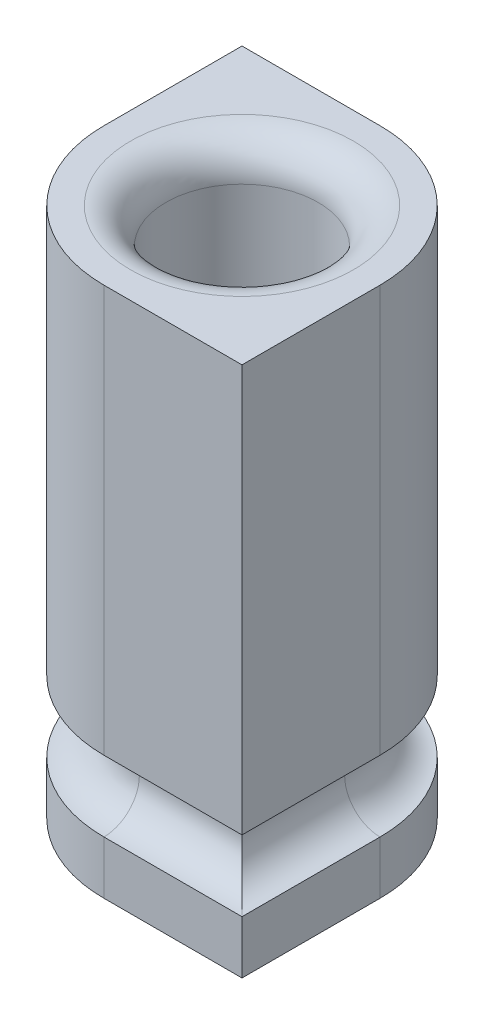
ISO-10303-21;
HEADER;
FILE_DESCRIPTION(('STEP AP214'),'2;1');
FILE_NAME('part.step','',(''),(''),'','','');
FILE_SCHEMA(('AUTOMOTIVE_DESIGN { 1 0 10303 214 1 1 1 1 }'));
ENDSEC;
DATA;
#1=APPLICATION_CONTEXT('core data for automotive mechanical design processes');
#2=APPLICATION_PROTOCOL_DEFINITION('international standard','automotive_design',2000,#1);
#3=PRODUCT_CONTEXT('',#1,'mechanical');
#4=PRODUCT('Part','Part','',(#3));
#5=PRODUCT_RELATED_PRODUCT_CATEGORY('part','',(#4));
#6=PRODUCT_DEFINITION_FORMATION('','',#4);
#7=PRODUCT_DEFINITION_CONTEXT('part definition',#1,'design');
#8=PRODUCT_DEFINITION('design','',#6,#7);
#9=PRODUCT_DEFINITION_SHAPE('','',#8);
#10=(LENGTH_UNIT() NAMED_UNIT(*) SI_UNIT(.MILLI.,.METRE.));
#11=(NAMED_UNIT(*) PLANE_ANGLE_UNIT() SI_UNIT($,.RADIAN.));
#12=(NAMED_UNIT(*) SI_UNIT($,.STERADIAN.) SOLID_ANGLE_UNIT());
#13=UNCERTAINTY_MEASURE_WITH_UNIT(LENGTH_MEASURE(1.E-05),#10,'distance_accuracy_value','');
#14=(GEOMETRIC_REPRESENTATION_CONTEXT(3) GLOBAL_UNCERTAINTY_ASSIGNED_CONTEXT((#13)) GLOBAL_UNIT_ASSIGNED_CONTEXT((#10,
#11,#12)) REPRESENTATION_CONTEXT('',''));
#15=CARTESIAN_POINT('',(0.,0.,0.));
#16=DIRECTION('',(0.,0.,1.));
#17=DIRECTION('',(1.,0.,0.));
#18=AXIS2_PLACEMENT_3D('',#15,#16,#17);
#19=CARTESIAN_POINT('',(3.9,5.,0.));
#20=DIRECTION('',(-1.,0.,0.));
#21=DIRECTION('',(0.,0.,1.));
#22=AXIS2_PLACEMENT_3D('',#19,#20,#21);
#23=PLANE('',#22);
#24=DIRECTION('',(0.,-1.,0.));
#25=VECTOR('',#24,1.);
#26=CARTESIAN_POINT('',(3.9,5.,3.9));
#27=LINE('',#26,#25);
#28=CARTESIAN_POINT('',(3.9,15.,3.9));
#29=VERTEX_POINT('',#28);
#30=CARTESIAN_POINT('',(3.9,3.5,3.9));
#31=VERTEX_POINT('',#30);
#32=EDGE_CURVE('E141',#29,#31,#27,.T.);
#33=ORIENTED_EDGE('',*,*,#32,.T.);
#34=DIRECTION('',(0.,0.,-1.));
#35=VECTOR('',#34,1.);
#36=CARTESIAN_POINT('',(3.9,3.5,0.));
#37=LINE('',#36,#35);
#38=CARTESIAN_POINT('',(3.9,3.5,0.));
#39=VERTEX_POINT('',#38);
#40=EDGE_CURVE('E568',#31,#39,#37,.T.);
#41=ORIENTED_EDGE('',*,*,#40,.T.);
#42=DIRECTION('',(0.,-1.,0.));
#43=VECTOR('',#42,1.);
#44=CARTESIAN_POINT('',(3.9,5.,0.));
#45=LINE('',#44,#43);
#46=CARTESIAN_POINT('',(3.9,15.,0.));
#47=VERTEX_POINT('',#46);
#48=EDGE_CURVE('E188',#47,#39,#45,.T.);
#49=ORIENTED_EDGE('',*,*,#48,.F.);
#50=DIRECTION('',(0.,0.,-1.));
#51=VECTOR('',#50,1.);
#52=CARTESIAN_POINT('',(3.9,15.,0.));
#53=LINE('',#52,#51);
#54=EDGE_CURVE('E195',#29,#47,#53,.T.);
#55=ORIENTED_EDGE('',*,*,#54,.F.);
#56=EDGE_LOOP('',(#33,#41,#49,#55));
#57=FACE_BOUND('',#56,.T.);
#58=ADVANCED_FACE('F33',(#57),#23,.F.);
#59=CARTESIAN_POINT('',(0.,5.,0.));
#60=DIRECTION('',(0.,-1.,0.));
#61=DIRECTION('',(0.,0.,-1.));
#62=AXIS2_PLACEMENT_3D('',#59,#60,#61);
#63=CYLINDRICAL_SURFACE('',#62,3.9);
#64=ORIENTED_EDGE('',*,*,#48,.T.);
#65=CARTESIAN_POINT('',(0.,3.5,0.));
#66=DIRECTION('',(0.,1.,0.));
#67=DIRECTION('',(0.,0.,1.));
#68=AXIS2_PLACEMENT_3D('',#65,#66,#67);
#69=CIRCLE('',#68,3.9);
#70=CARTESIAN_POINT('',(0.,3.5,-3.9));
#71=VERTEX_POINT('',#70);
#72=EDGE_CURVE('E571',#39,#71,#69,.T.);
#73=ORIENTED_EDGE('',*,*,#72,.T.);
#74=DIRECTION('',(0.,-1.,0.));
#75=VECTOR('',#74,1.);
#76=CARTESIAN_POINT('',(0.,5.,-3.9));
#77=LINE('',#76,#75);
#78=CARTESIAN_POINT('',(0.,15.,-3.9));
#79=VERTEX_POINT('',#78);
#80=EDGE_CURVE('E184',#79,#71,#77,.T.);
#81=ORIENTED_EDGE('',*,*,#80,.F.);
#82=CARTESIAN_POINT('',(0.,15.,0.));
#83=DIRECTION('',(0.,1.,0.));
#84=DIRECTION('',(0.,0.,1.));
#85=AXIS2_PLACEMENT_3D('',#82,#83,#84);
#86=CIRCLE('',#85,3.9);
#87=EDGE_CURVE('E592',#47,#79,#86,.T.);
#88=ORIENTED_EDGE('',*,*,#87,.F.);
#89=EDGE_LOOP('',(#64,#73,#81,#88));
#90=FACE_BOUND('',#89,.T.);
#91=ADVANCED_FACE('F256',(#90),#63,.T.);
#92=CARTESIAN_POINT('',(-3.9,5.,-3.9));
#93=DIRECTION('',(0.,0.,1.));
#94=DIRECTION('',(1.,0.,0.));
#95=AXIS2_PLACEMENT_3D('',#92,#93,#94);
#96=PLANE('',#95);
#97=ORIENTED_EDGE('',*,*,#80,.T.);
#98=DIRECTION('',(-1.,0.,0.));
#99=VECTOR('',#98,1.);
#100=CARTESIAN_POINT('',(-3.9,3.5,-3.9));
#101=LINE('',#100,#99);
#102=CARTESIAN_POINT('',(-3.9,3.5,-3.9));
#103=VERTEX_POINT('',#102);
#104=EDGE_CURVE('E161',#71,#103,#101,.T.);
#105=ORIENTED_EDGE('',*,*,#104,.T.);
#106=DIRECTION('',(0.,-1.,0.));
#107=VECTOR('',#106,1.);
#108=CARTESIAN_POINT('',(-3.9,5.,-3.9));
#109=LINE('',#108,#107);
#110=CARTESIAN_POINT('',(-3.9,15.,-3.9));
#111=VERTEX_POINT('',#110);
#112=EDGE_CURVE('E180',#111,#103,#109,.T.);
#113=ORIENTED_EDGE('',*,*,#112,.F.);
#114=DIRECTION('',(-1.,0.,0.));
#115=VECTOR('',#114,1.);
#116=CARTESIAN_POINT('',(0.,15.,-3.9));
#117=LINE('',#116,#115);
#118=EDGE_CURVE('E588',#79,#111,#117,.T.);
#119=ORIENTED_EDGE('',*,*,#118,.F.);
#120=EDGE_LOOP('',(#97,#105,#113,#119));
#121=FACE_BOUND('',#120,.T.);
#122=ADVANCED_FACE('F262',(#121),#96,.F.);
#123=CARTESIAN_POINT('',(-3.9,5.,-3.9));
#124=DIRECTION('',(1.,0.,0.));
#125=DIRECTION('',(0.,0.,-1.));
#126=AXIS2_PLACEMENT_3D('',#123,#124,#125);
#127=PLANE('',#126);
#128=ORIENTED_EDGE('',*,*,#112,.T.);
#129=DIRECTION('',(0.,0.,1.));
#130=VECTOR('',#129,1.);
#131=CARTESIAN_POINT('',(-3.9,3.5,0.));
#132=LINE('',#131,#130);
#133=CARTESIAN_POINT('',(-3.9,3.5,0.));
#134=VERTEX_POINT('',#133);
#135=EDGE_CURVE('E157',#103,#134,#132,.T.);
#136=ORIENTED_EDGE('',*,*,#135,.T.);
#137=DIRECTION('',(0.,-1.,0.));
#138=VECTOR('',#137,1.);
#139=CARTESIAN_POINT('',(-3.9,5.,0.));
#140=LINE('',#139,#138);
#141=CARTESIAN_POINT('',(-3.9,15.,0.));
#142=VERTEX_POINT('',#141);
#143=EDGE_CURVE('E176',#142,#134,#140,.T.);
#144=ORIENTED_EDGE('',*,*,#143,.F.);
#145=DIRECTION('',(0.,0.,1.));
#146=VECTOR('',#145,1.);
#147=CARTESIAN_POINT('',(-3.9,15.,-3.9));
#148=LINE('',#147,#146);
#149=EDGE_CURVE('E580',#111,#142,#148,.T.);
#150=ORIENTED_EDGE('',*,*,#149,.F.);
#151=EDGE_LOOP('',(#128,#136,#144,#150));
#152=FACE_BOUND('',#151,.T.);
#153=ADVANCED_FACE('F284',(#152),#127,.F.);
#154=CARTESIAN_POINT('',(0.,5.,0.));
#155=DIRECTION('',(0.,-1.,0.));
#156=DIRECTION('',(0.,0.,-1.));
#157=AXIS2_PLACEMENT_3D('',#154,#155,#156);
#158=CYLINDRICAL_SURFACE('',#157,3.9);
#159=ORIENTED_EDGE('',*,*,#143,.T.);
#160=CARTESIAN_POINT('',(0.,3.5,0.));
#161=DIRECTION('',(0.,1.,0.));
#162=DIRECTION('',(0.,0.,1.));
#163=AXIS2_PLACEMENT_3D('',#160,#161,#162);
#164=CIRCLE('',#163,3.9);
#165=CARTESIAN_POINT('',(0.,3.5,3.9));
#166=VERTEX_POINT('',#165);
#167=EDGE_CURVE('E542',#134,#166,#164,.T.);
#168=ORIENTED_EDGE('',*,*,#167,.T.);
#169=DIRECTION('',(0.,-1.,0.));
#170=VECTOR('',#169,1.);
#171=CARTESIAN_POINT('',(0.,5.,3.9));
#172=LINE('',#171,#170);
#173=CARTESIAN_POINT('',(0.,15.,3.9));
#174=VERTEX_POINT('',#173);
#175=EDGE_CURVE('E172',#174,#166,#172,.T.);
#176=ORIENTED_EDGE('',*,*,#175,.F.);
#177=CARTESIAN_POINT('',(0.,15.,0.));
#178=DIRECTION('',(0.,1.,0.));
#179=DIRECTION('',(0.,0.,1.));
#180=AXIS2_PLACEMENT_3D('',#177,#178,#179);
#181=CIRCLE('',#180,3.9);
#182=EDGE_CURVE('E587',#142,#174,#181,.T.);
#183=ORIENTED_EDGE('',*,*,#182,.F.);
#184=EDGE_LOOP('',(#159,#168,#176,#183));
#185=FACE_BOUND('',#184,.T.);
#186=ADVANCED_FACE('F288',(#185),#158,.T.);
#187=CARTESIAN_POINT('',(0.,5.,3.9));
#188=DIRECTION('',(0.,0.,-1.));
#189=DIRECTION('',(-1.,0.,0.));
#190=AXIS2_PLACEMENT_3D('',#187,#188,#189);
#191=PLANE('',#190);
#192=ORIENTED_EDGE('',*,*,#175,.T.);
#193=DIRECTION('',(1.,0.,0.));
#194=VECTOR('',#193,1.);
#195=CARTESIAN_POINT('',(3.9,3.5,3.9));
#196=LINE('',#195,#194);
#197=EDGE_CURVE('E566',#166,#31,#196,.T.);
#198=ORIENTED_EDGE('',*,*,#197,.T.);
#199=ORIENTED_EDGE('',*,*,#32,.F.);
#200=DIRECTION('',(1.,0.,0.));
#201=VECTOR('',#200,1.);
#202=CARTESIAN_POINT('',(3.9,15.,3.9));
#203=LINE('',#202,#201);
#204=EDGE_CURVE('E590',#174,#29,#203,.T.);
#205=ORIENTED_EDGE('',*,*,#204,.F.);
#206=EDGE_LOOP('',(#192,#198,#199,#205));
#207=FACE_BOUND('',#206,.T.);
#208=ADVANCED_FACE('F292',(#207),#191,.F.);
#209=CARTESIAN_POINT('',(0.,0.,0.));
#210=DIRECTION('',(0.,1.,0.));
#211=DIRECTION('',(0.,0.,1.));
#212=AXIS2_PLACEMENT_3D('',#209,#210,#211);
#213=PLANE('',#212);
#214=DIRECTION('',(0.,0.,-1.));
#215=VECTOR('',#214,1.);
#216=CARTESIAN_POINT('',(3.9,0.,0.));
#217=LINE('',#216,#215);
#218=CARTESIAN_POINT('',(3.9,0.,3.9));
#219=VERTEX_POINT('',#218);
#220=CARTESIAN_POINT('',(3.9,0.,0.));
#221=VERTEX_POINT('',#220);
#222=EDGE_CURVE('E139',#219,#221,#217,.T.);
#223=ORIENTED_EDGE('',*,*,#222,.F.);
#224=DIRECTION('',(1.,0.,0.));
#225=VECTOR('',#224,1.);
#226=CARTESIAN_POINT('',(0.,0.,3.9));
#227=LINE('',#226,#225);
#228=CARTESIAN_POINT('',(0.,0.,3.9));
#229=VERTEX_POINT('',#228);
#230=EDGE_CURVE('E142',#229,#219,#227,.T.);
#231=ORIENTED_EDGE('',*,*,#230,.F.);
#232=CARTESIAN_POINT('',(0.,0.,0.));
#233=DIRECTION('',(0.,1.,0.));
#234=DIRECTION('',(0.,0.,1.));
#235=AXIS2_PLACEMENT_3D('',#232,#233,#234);
#236=CIRCLE('',#235,3.9);
#237=CARTESIAN_POINT('',(-3.9,0.,0.));
#238=VERTEX_POINT('',#237);
#239=EDGE_CURVE('E150',#238,#229,#236,.T.);
#240=ORIENTED_EDGE('',*,*,#239,.F.);
#241=DIRECTION('',(0.,0.,1.));
#242=VECTOR('',#241,1.);
#243=CARTESIAN_POINT('',(-3.9,0.,-3.9));
#244=LINE('',#243,#242);
#245=CARTESIAN_POINT('',(-3.9,0.,-3.9));
#246=VERTEX_POINT('',#245);
#247=EDGE_CURVE('E167',#246,#238,#244,.T.);
#248=ORIENTED_EDGE('',*,*,#247,.F.);
#249=DIRECTION('',(-1.,0.,0.));
#250=VECTOR('',#249,1.);
#251=CARTESIAN_POINT('',(-3.9,0.,-3.9));
#252=LINE('',#251,#250);
#253=CARTESIAN_POINT('',(0.,0.,-3.9));
#254=VERTEX_POINT('',#253);
#255=EDGE_CURVE('E159',#254,#246,#252,.T.);
#256=ORIENTED_EDGE('',*,*,#255,.F.);
#257=CARTESIAN_POINT('',(0.,0.,0.));
#258=DIRECTION('',(0.,1.,0.));
#259=DIRECTION('',(0.,0.,1.));
#260=AXIS2_PLACEMENT_3D('',#257,#258,#259);
#261=CIRCLE('',#260,3.9);
#262=EDGE_CURVE('E156',#221,#254,#261,.T.);
#263=ORIENTED_EDGE('',*,*,#262,.F.);
#264=EDGE_LOOP('',(#223,#231,#240,#248,#256,#263));
#265=FACE_BOUND('',#264,.T.);
#266=ADVANCED_FACE('F153',(#265),#213,.F.);
#267=DIRECTION('',(1.,0.,0.));
#268=VECTOR('',#267,1.);
#269=CARTESIAN_POINT('',(3.9,1.5,3.9));
#270=LINE('',#269,#268);
#271=CARTESIAN_POINT('',(0.,1.5,3.9));
#272=VERTEX_POINT('',#271);
#273=CARTESIAN_POINT('',(3.9,1.5,3.9));
#274=VERTEX_POINT('',#273);
#275=EDGE_CURVE('E50',#272,#274,#270,.T.);
#276=ORIENTED_EDGE('',*,*,#275,.F.);
#277=EDGE_CURVE('E146',#272,#229,#172,.T.);
#278=ORIENTED_EDGE('',*,*,#277,.T.);
#279=ORIENTED_EDGE('',*,*,#230,.T.);
#280=EDGE_CURVE('E134',#274,#219,#27,.T.);
#281=ORIENTED_EDGE('',*,*,#280,.F.);
#282=EDGE_LOOP('',(#276,#278,#279,#281));
#283=FACE_BOUND('',#282,.T.);
#284=ADVANCED_FACE('F145',(#283),#191,.F.);
#285=CARTESIAN_POINT('',(0.,1.5,0.));
#286=DIRECTION('',(0.,1.,0.));
#287=DIRECTION('',(0.,0.,1.));
#288=AXIS2_PLACEMENT_3D('',#285,#286,#287);
#289=CIRCLE('',#288,3.9);
#290=CARTESIAN_POINT('',(-3.9,1.5,0.));
#291=VERTEX_POINT('',#290);
#292=EDGE_CURVE('E238',#291,#272,#289,.T.);
#293=ORIENTED_EDGE('',*,*,#292,.F.);
#294=EDGE_CURVE('E175',#291,#238,#140,.T.);
#295=ORIENTED_EDGE('',*,*,#294,.T.);
#296=ORIENTED_EDGE('',*,*,#239,.T.);
#297=ORIENTED_EDGE('',*,*,#277,.F.);
#298=EDGE_LOOP('',(#293,#295,#296,#297));
#299=FACE_BOUND('',#298,.T.);
#300=ADVANCED_FACE('F294',(#299),#158,.T.);
#301=DIRECTION('',(0.,0.,1.));
#302=VECTOR('',#301,1.);
#303=CARTESIAN_POINT('',(-3.9,1.5,0.));
#304=LINE('',#303,#302);
#305=CARTESIAN_POINT('',(-3.9,1.5,-3.9));
#306=VERTEX_POINT('',#305);
#307=EDGE_CURVE('E538',#306,#291,#304,.T.);
#308=ORIENTED_EDGE('',*,*,#307,.F.);
#309=EDGE_CURVE('E179',#306,#246,#109,.T.);
#310=ORIENTED_EDGE('',*,*,#309,.T.);
#311=ORIENTED_EDGE('',*,*,#247,.T.);
#312=ORIENTED_EDGE('',*,*,#294,.F.);
#313=EDGE_LOOP('',(#308,#310,#311,#312));
#314=FACE_BOUND('',#313,.T.);
#315=ADVANCED_FACE('F279',(#314),#127,.F.);
#316=DIRECTION('',(-1.,0.,0.));
#317=VECTOR('',#316,1.);
#318=CARTESIAN_POINT('',(-3.9,1.5,-3.9));
#319=LINE('',#318,#317);
#320=CARTESIAN_POINT('',(0.,1.5,-3.9));
#321=VERTEX_POINT('',#320);
#322=EDGE_CURVE('E543',#321,#306,#319,.T.);
#323=ORIENTED_EDGE('',*,*,#322,.F.);
#324=EDGE_CURVE('E183',#321,#254,#77,.T.);
#325=ORIENTED_EDGE('',*,*,#324,.T.);
#326=ORIENTED_EDGE('',*,*,#255,.T.);
#327=ORIENTED_EDGE('',*,*,#309,.F.);
#328=EDGE_LOOP('',(#323,#325,#326,#327));
#329=FACE_BOUND('',#328,.T.);
#330=ADVANCED_FACE('F274',(#329),#96,.F.);
#331=CARTESIAN_POINT('',(0.,1.5,0.));
#332=DIRECTION('',(0.,1.,0.));
#333=DIRECTION('',(0.,0.,1.));
#334=AXIS2_PLACEMENT_3D('',#331,#332,#333);
#335=CIRCLE('',#334,3.9);
#336=CARTESIAN_POINT('',(3.9,1.5,0.));
#337=VERTEX_POINT('',#336);
#338=EDGE_CURVE('E558',#337,#321,#335,.T.);
#339=ORIENTED_EDGE('',*,*,#338,.F.);
#340=EDGE_CURVE('E187',#337,#221,#45,.T.);
#341=ORIENTED_EDGE('',*,*,#340,.T.);
#342=ORIENTED_EDGE('',*,*,#262,.T.);
#343=ORIENTED_EDGE('',*,*,#324,.F.);
#344=EDGE_LOOP('',(#339,#341,#342,#343));
#345=FACE_BOUND('',#344,.T.);
#346=ADVANCED_FACE('F265',(#345),#63,.T.);
#347=DIRECTION('',(0.,0.,-1.));
#348=VECTOR('',#347,1.);
#349=CARTESIAN_POINT('',(3.9,1.5,0.));
#350=LINE('',#349,#348);
#351=EDGE_CURVE('E140',#274,#337,#350,.T.);
#352=ORIENTED_EDGE('',*,*,#351,.F.);
#353=ORIENTED_EDGE('',*,*,#280,.T.);
#354=ORIENTED_EDGE('',*,*,#222,.T.);
#355=ORIENTED_EDGE('',*,*,#340,.F.);
#356=EDGE_LOOP('',(#352,#353,#354,#355));
#357=FACE_BOUND('',#356,.T.);
#358=ADVANCED_FACE('F136',(#357),#23,.F.);
#359=CARTESIAN_POINT('',(-3.9,2.5,0.));
#360=DIRECTION('',(0.,0.,1.));
#361=DIRECTION('',(1.,0.,0.));
#362=AXIS2_PLACEMENT_3D('',#359,#360,#361);
#363=CYLINDRICAL_SURFACE('',#362,1.);
#364=CARTESIAN_POINT('',(-3.9,2.5,-3.9));
#365=DIRECTION('',(-0.707106781186547,0.,0.707106781186547));
#366=DIRECTION('',(-0.707106781186547,0.,-0.707106781186547));
#367=AXIS2_PLACEMENT_3D('',#364,#365,#366);
#368=ELLIPSE('',#367,1.41421356237309,1.);
#369=CARTESIAN_POINT('',(-2.9,2.5,-2.9));
#370=VERTEX_POINT('',#369);
#371=EDGE_CURVE('E234',#306,#370,#368,.T.);
#372=ORIENTED_EDGE('',*,*,#371,.F.);
#373=ORIENTED_EDGE('',*,*,#307,.T.);
#374=CARTESIAN_POINT('',(-3.9,2.5,0.));
#375=DIRECTION('',(0.,0.,-1.));
#376=DIRECTION('',(-1.,0.,0.));
#377=AXIS2_PLACEMENT_3D('',#374,#375,#376);
#378=CIRCLE('',#377,1.);
#379=CARTESIAN_POINT('',(-2.9,2.5,0.));
#380=VERTEX_POINT('',#379);
#381=EDGE_CURVE('E80',#380,#291,#378,.T.);
#382=ORIENTED_EDGE('',*,*,#381,.F.);
#383=DIRECTION('',(0.,0.,1.));
#384=VECTOR('',#383,1.);
#385=CARTESIAN_POINT('',(-2.9,2.5,0.));
#386=LINE('',#385,#384);
#387=EDGE_CURVE('E75',#370,#380,#386,.T.);
#388=ORIENTED_EDGE('',*,*,#387,.F.);
#389=EDGE_LOOP('',(#372,#373,#382,#388));
#390=FACE_BOUND('',#389,.T.);
#391=ADVANCED_FACE('F268',(#390),#363,.F.);
#392=CARTESIAN_POINT('',(0.,2.5,0.));
#393=DIRECTION('',(0.,1.,0.));
#394=DIRECTION('',(0.,0.,1.));
#395=AXIS2_PLACEMENT_3D('',#392,#393,#394);
#396=TOROIDAL_SURFACE('',#395,3.9,1.);
#397=ORIENTED_EDGE('',*,*,#381,.T.);
#398=ORIENTED_EDGE('',*,*,#292,.T.);
#399=CARTESIAN_POINT('',(0.,2.5,3.9));
#400=DIRECTION('',(-1.,0.,0.));
#401=DIRECTION('',(0.,0.,1.));
#402=AXIS2_PLACEMENT_3D('',#399,#400,#401);
#403=CIRCLE('',#402,1.);
#404=CARTESIAN_POINT('',(0.,2.5,2.9));
#405=VERTEX_POINT('',#404);
#406=EDGE_CURVE('E231',#405,#272,#403,.T.);
#407=ORIENTED_EDGE('',*,*,#406,.F.);
#408=CARTESIAN_POINT('',(0.,2.5,0.));
#409=DIRECTION('',(0.,1.,0.));
#410=DIRECTION('',(0.,0.,1.));
#411=AXIS2_PLACEMENT_3D('',#408,#409,#410);
#412=CIRCLE('',#411,2.9);
#413=EDGE_CURVE('E228',#380,#405,#412,.T.);
#414=ORIENTED_EDGE('',*,*,#413,.F.);
#415=EDGE_LOOP('',(#397,#398,#407,#414));
#416=FACE_BOUND('',#415,.T.);
#417=ADVANCED_FACE('F273',(#416),#396,.F.);
#418=CARTESIAN_POINT('',(-3.9,2.5,0.));
#419=DIRECTION('',(0.,0.,-1.));
#420=DIRECTION('',(-1.,0.,0.));
#421=AXIS2_PLACEMENT_3D('',#418,#419,#420);
#422=CYLINDRICAL_SURFACE('',#421,1.);
#423=CARTESIAN_POINT('',(-3.9,2.5,-3.9));
#424=DIRECTION('',(0.707106781186547,0.,-0.707106781186547));
#425=DIRECTION('',(-0.707106781186547,0.,-0.707106781186547));
#426=AXIS2_PLACEMENT_3D('',#423,#424,#425);
#427=ELLIPSE('',#426,1.41421356237309,1.);
#428=EDGE_CURVE('E222',#370,#103,#427,.F.);
#429=ORIENTED_EDGE('',*,*,#428,.F.);
#430=ORIENTED_EDGE('',*,*,#387,.T.);
#431=CARTESIAN_POINT('',(-3.9,2.5,0.));
#432=DIRECTION('',(0.,0.,-1.));
#433=DIRECTION('',(-1.,0.,0.));
#434=AXIS2_PLACEMENT_3D('',#431,#432,#433);
#435=CIRCLE('',#434,1.);
#436=EDGE_CURVE('E225',#134,#380,#435,.T.);
#437=ORIENTED_EDGE('',*,*,#436,.F.);
#438=ORIENTED_EDGE('',*,*,#135,.F.);
#439=EDGE_LOOP('',(#429,#430,#437,#438));
#440=FACE_BOUND('',#439,.T.);
#441=ADVANCED_FACE('F459',(#440),#422,.F.);
#442=CARTESIAN_POINT('',(-2.9,2.5,-3.9));
#443=DIRECTION('',(-1.,0.,0.));
#444=DIRECTION('',(0.,0.,1.));
#445=AXIS2_PLACEMENT_3D('',#442,#443,#444);
#446=CYLINDRICAL_SURFACE('',#445,1.);
#447=ORIENTED_EDGE('',*,*,#322,.T.);
#448=ORIENTED_EDGE('',*,*,#371,.T.);
#449=DIRECTION('',(-1.,0.,0.));
#450=VECTOR('',#449,1.);
#451=CARTESIAN_POINT('',(-2.9,2.5,-2.9));
#452=LINE('',#451,#450);
#453=CARTESIAN_POINT('',(0.,2.5,-2.9));
#454=VERTEX_POINT('',#453);
#455=EDGE_CURVE('E219',#454,#370,#452,.T.);
#456=ORIENTED_EDGE('',*,*,#455,.F.);
#457=CARTESIAN_POINT('',(0.,2.5,-3.9));
#458=DIRECTION('',(-1.,0.,0.));
#459=DIRECTION('',(0.,0.,1.));
#460=AXIS2_PLACEMENT_3D('',#457,#458,#459);
#461=CIRCLE('',#460,1.);
#462=EDGE_CURVE('E216',#321,#454,#461,.T.);
#463=ORIENTED_EDGE('',*,*,#462,.F.);
#464=EDGE_LOOP('',(#447,#448,#456,#463));
#465=FACE_BOUND('',#464,.T.);
#466=ADVANCED_FACE('F449',(#465),#446,.F.);
#467=CARTESIAN_POINT('',(2.9,2.5,3.9));
#468=DIRECTION('',(1.,0.,0.));
#469=DIRECTION('',(0.,0.,-1.));
#470=AXIS2_PLACEMENT_3D('',#467,#468,#469);
#471=CYLINDRICAL_SURFACE('',#470,1.);
#472=ORIENTED_EDGE('',*,*,#406,.T.);
#473=ORIENTED_EDGE('',*,*,#275,.T.);
#474=CARTESIAN_POINT('',(3.9,2.5,3.9));
#475=DIRECTION('',(0.707106781186547,0.,-0.707106781186547));
#476=DIRECTION('',(0.707106781186547,0.,0.707106781186547));
#477=AXIS2_PLACEMENT_3D('',#474,#475,#476);
#478=ELLIPSE('',#477,1.41421356237309,1.);
#479=CARTESIAN_POINT('',(2.9,2.5,2.9));
#480=VERTEX_POINT('',#479);
#481=EDGE_CURVE('E87',#480,#274,#478,.F.);
#482=ORIENTED_EDGE('',*,*,#481,.F.);
#483=DIRECTION('',(1.,0.,0.));
#484=VECTOR('',#483,1.);
#485=CARTESIAN_POINT('',(2.9,2.5,2.9));
#486=LINE('',#485,#484);
#487=EDGE_CURVE('E210',#405,#480,#486,.T.);
#488=ORIENTED_EDGE('',*,*,#487,.F.);
#489=EDGE_LOOP('',(#472,#473,#482,#488));
#490=FACE_BOUND('',#489,.T.);
#491=ADVANCED_FACE('F439',(#490),#471,.F.);
#492=CARTESIAN_POINT('',(0.,2.5,0.));
#493=DIRECTION('',(0.,1.,0.));
#494=DIRECTION('',(0.,0.,1.));
#495=AXIS2_PLACEMENT_3D('',#492,#493,#494);
#496=TOROIDAL_SURFACE('',#495,3.9,1.);
#497=ORIENTED_EDGE('',*,*,#436,.T.);
#498=ORIENTED_EDGE('',*,*,#413,.T.);
#499=CARTESIAN_POINT('',(0.,2.5,3.9));
#500=DIRECTION('',(-1.,0.,0.));
#501=DIRECTION('',(0.,0.,1.));
#502=AXIS2_PLACEMENT_3D('',#499,#500,#501);
#503=CIRCLE('',#502,1.);
#504=EDGE_CURVE('E207',#166,#405,#503,.T.);
#505=ORIENTED_EDGE('',*,*,#504,.F.);
#506=ORIENTED_EDGE('',*,*,#167,.F.);
#507=EDGE_LOOP('',(#497,#498,#505,#506));
#508=FACE_BOUND('',#507,.T.);
#509=ADVANCED_FACE('F429',(#508),#496,.F.);
#510=CARTESIAN_POINT('',(0.,2.5,-3.9));
#511=DIRECTION('',(1.,0.,0.));
#512=DIRECTION('',(0.,0.,-1.));
#513=AXIS2_PLACEMENT_3D('',#510,#511,#512);
#514=CYLINDRICAL_SURFACE('',#513,1.);
#515=ORIENTED_EDGE('',*,*,#428,.T.);
#516=ORIENTED_EDGE('',*,*,#104,.F.);
#517=CARTESIAN_POINT('',(0.,2.5,-3.9));
#518=DIRECTION('',(-1.,0.,0.));
#519=DIRECTION('',(0.,0.,1.));
#520=AXIS2_PLACEMENT_3D('',#517,#518,#519);
#521=CIRCLE('',#520,1.);
#522=EDGE_CURVE('E204',#454,#71,#521,.T.);
#523=ORIENTED_EDGE('',*,*,#522,.F.);
#524=ORIENTED_EDGE('',*,*,#455,.T.);
#525=EDGE_LOOP('',(#515,#516,#523,#524));
#526=FACE_BOUND('',#525,.T.);
#527=ADVANCED_FACE('F419',(#526),#514,.F.);
#528=CARTESIAN_POINT('',(0.,2.5,0.));
#529=DIRECTION('',(0.,1.,0.));
#530=DIRECTION('',(0.,0.,1.));
#531=AXIS2_PLACEMENT_3D('',#528,#529,#530);
#532=TOROIDAL_SURFACE('',#531,3.9,1.);
#533=CARTESIAN_POINT('',(3.9,2.5,0.));
#534=DIRECTION('',(0.,0.,-1.));
#535=DIRECTION('',(-1.,0.,0.));
#536=AXIS2_PLACEMENT_3D('',#533,#534,#535);
#537=CIRCLE('',#536,1.);
#538=CARTESIAN_POINT('',(2.9,2.5,0.));
#539=VERTEX_POINT('',#538);
#540=EDGE_CURVE('E214',#337,#539,#537,.T.);
#541=ORIENTED_EDGE('',*,*,#540,.F.);
#542=ORIENTED_EDGE('',*,*,#338,.T.);
#543=ORIENTED_EDGE('',*,*,#462,.T.);
#544=CARTESIAN_POINT('',(0.,2.5,0.));
#545=DIRECTION('',(0.,1.,0.));
#546=DIRECTION('',(0.,0.,1.));
#547=AXIS2_PLACEMENT_3D('',#544,#545,#546);
#548=CIRCLE('',#547,2.9);
#549=EDGE_CURVE('E201',#539,#454,#548,.T.);
#550=ORIENTED_EDGE('',*,*,#549,.F.);
#551=EDGE_LOOP('',(#541,#542,#543,#550));
#552=FACE_BOUND('',#551,.T.);
#553=ADVANCED_FACE('F410',(#552),#532,.F.);
#554=CARTESIAN_POINT('',(3.9,2.5,0.));
#555=DIRECTION('',(0.,0.,-1.));
#556=DIRECTION('',(-1.,0.,0.));
#557=AXIS2_PLACEMENT_3D('',#554,#555,#556);
#558=CYLINDRICAL_SURFACE('',#557,1.);
#559=ORIENTED_EDGE('',*,*,#351,.T.);
#560=ORIENTED_EDGE('',*,*,#540,.T.);
#561=DIRECTION('',(0.,0.,-1.));
#562=VECTOR('',#561,1.);
#563=CARTESIAN_POINT('',(2.9,2.5,0.));
#564=LINE('',#563,#562);
#565=EDGE_CURVE('E198',#480,#539,#564,.T.);
#566=ORIENTED_EDGE('',*,*,#565,.F.);
#567=ORIENTED_EDGE('',*,*,#481,.T.);
#568=EDGE_LOOP('',(#559,#560,#566,#567));
#569=FACE_BOUND('',#568,.T.);
#570=ADVANCED_FACE('F400',(#569),#558,.F.);
#571=CARTESIAN_POINT('',(0.,2.5,3.9));
#572=DIRECTION('',(-1.,0.,0.));
#573=DIRECTION('',(0.,0.,1.));
#574=AXIS2_PLACEMENT_3D('',#571,#572,#573);
#575=CYLINDRICAL_SURFACE('',#574,1.);
#576=ORIENTED_EDGE('',*,*,#504,.T.);
#577=ORIENTED_EDGE('',*,*,#487,.T.);
#578=CARTESIAN_POINT('',(3.9,2.5,3.9));
#579=DIRECTION('',(-0.707106781186547,0.,0.707106781186547));
#580=DIRECTION('',(-0.707106781186547,0.,-0.707106781186547));
#581=AXIS2_PLACEMENT_3D('',#578,#579,#580);
#582=ELLIPSE('',#581,1.41421356237309,1.);
#583=EDGE_CURVE('E194',#31,#480,#582,.T.);
#584=ORIENTED_EDGE('',*,*,#583,.F.);
#585=ORIENTED_EDGE('',*,*,#197,.F.);
#586=EDGE_LOOP('',(#576,#577,#584,#585));
#587=FACE_BOUND('',#586,.T.);
#588=ADVANCED_FACE('F390',(#587),#575,.F.);
#589=CARTESIAN_POINT('',(0.,2.5,0.));
#590=DIRECTION('',(0.,1.,0.));
#591=DIRECTION('',(0.,0.,1.));
#592=AXIS2_PLACEMENT_3D('',#589,#590,#591);
#593=TOROIDAL_SURFACE('',#592,3.9,1.);
#594=ORIENTED_EDGE('',*,*,#522,.T.);
#595=ORIENTED_EDGE('',*,*,#72,.F.);
#596=CARTESIAN_POINT('',(3.9,2.5,0.));
#597=DIRECTION('',(0.,0.,-1.));
#598=DIRECTION('',(0.,1.,0.));
#599=AXIS2_PLACEMENT_3D('',#596,#597,#598);
#600=CIRCLE('',#599,1.);
#601=EDGE_CURVE('E192',#539,#39,#600,.T.);
#602=ORIENTED_EDGE('',*,*,#601,.F.);
#603=ORIENTED_EDGE('',*,*,#549,.T.);
#604=EDGE_LOOP('',(#594,#595,#602,#603));
#605=FACE_BOUND('',#604,.T.);
#606=ADVANCED_FACE('F381',(#605),#593,.F.);
#607=CARTESIAN_POINT('',(3.9,2.5,0.));
#608=DIRECTION('',(0.,0.,1.));
#609=DIRECTION('',(1.,0.,0.));
#610=AXIS2_PLACEMENT_3D('',#607,#608,#609);
#611=CYLINDRICAL_SURFACE('',#610,1.);
#612=ORIENTED_EDGE('',*,*,#583,.T.);
#613=ORIENTED_EDGE('',*,*,#565,.T.);
#614=ORIENTED_EDGE('',*,*,#601,.T.);
#615=ORIENTED_EDGE('',*,*,#40,.F.);
#616=EDGE_LOOP('',(#612,#613,#614,#615));
#617=FACE_BOUND('',#616,.T.);
#618=ADVANCED_FACE('F303',(#617),#611,.F.);
#619=CARTESIAN_POINT('',(0.,15.,0.));
#620=DIRECTION('',(0.,1.,0.));
#621=DIRECTION('',(0.,0.,1.));
#622=AXIS2_PLACEMENT_3D('',#619,#620,#621);
#623=PLANE('',#622);
#624=CARTESIAN_POINT('',(0.,15.,0.));
#625=DIRECTION('',(0.,1.,0.));
#626=DIRECTION('',(0.,0.,1.));
#627=AXIS2_PLACEMENT_3D('',#624,#625,#626);
#628=CIRCLE('',#627,3.15);
#629=CARTESIAN_POINT('',(0.,15.,3.15));
#630=VERTEX_POINT('',#629);
#631=EDGE_CURVE('E11',#630,#630,#628,.F.);
#632=ORIENTED_EDGE('',*,*,#631,.T.);
#633=EDGE_LOOP('',(#632));
#634=FACE_BOUND('',#633,.T.);
#635=ORIENTED_EDGE('',*,*,#87,.T.);
#636=ORIENTED_EDGE('',*,*,#118,.T.);
#637=ORIENTED_EDGE('',*,*,#149,.T.);
#638=ORIENTED_EDGE('',*,*,#182,.T.);
#639=ORIENTED_EDGE('',*,*,#204,.T.);
#640=ORIENTED_EDGE('',*,*,#54,.T.);
#641=EDGE_LOOP('',(#635,#636,#637,#638,#639,#640));
#642=FACE_BOUND('',#641,.T.);
#643=ADVANCED_FACE('F300',(#634,#642),#623,.T.);
#644=CARTESIAN_POINT('',(0.,15.,0.));
#645=DIRECTION('',(0.,-1.,0.));
#646=DIRECTION('',(0.,0.,-1.));
#647=AXIS2_PLACEMENT_3D('',#644,#645,#646);
#648=CYLINDRICAL_SURFACE('',#647,2.15);
#649=CARTESIAN_POINT('',(0.,14.,0.));
#650=DIRECTION('',(0.,1.,0.));
#651=DIRECTION('',(0.,0.,1.));
#652=AXIS2_PLACEMENT_3D('',#649,#650,#651);
#653=CIRCLE('',#652,2.15);
#654=CARTESIAN_POINT('',(0.,14.,2.15));
#655=VERTEX_POINT('',#654);
#656=EDGE_CURVE('E42',#655,#655,#653,.T.);
#657=ORIENTED_EDGE('',*,*,#656,.T.);
#658=EDGE_LOOP('',(#657));
#659=FACE_BOUND('',#658,.T.);
#660=CARTESIAN_POINT('',(0.,5.,0.));
#661=DIRECTION('',(0.,1.,0.));
#662=DIRECTION('',(0.,0.,1.));
#663=AXIS2_PLACEMENT_3D('',#660,#661,#662);
#664=CIRCLE('',#663,2.15);
#665=CARTESIAN_POINT('',(0.,5.,2.15));
#666=VERTEX_POINT('',#665);
#667=EDGE_CURVE('E191',#666,#666,#664,.F.);
#668=ORIENTED_EDGE('',*,*,#667,.T.);
#669=EDGE_LOOP('',(#668));
#670=FACE_BOUND('',#669,.T.);
#671=ADVANCED_FACE('F243',(#659,#670),#648,.F.);
#672=CARTESIAN_POINT('',(0.,5.,0.));
#673=DIRECTION('',(0.,1.,0.));
#674=DIRECTION('',(0.,0.,1.));
#675=AXIS2_PLACEMENT_3D('',#672,#673,#674);
#676=PLANE('',#675);
#677=ORIENTED_EDGE('',*,*,#667,.F.);
#678=EDGE_LOOP('',(#677));
#679=FACE_BOUND('',#678,.T.);
#680=ADVANCED_FACE('F247',(#679),#676,.T.);
#681=CARTESIAN_POINT('',(0.,14.,0.));
#682=DIRECTION('',(0.,1.,0.));
#683=DIRECTION('',(0.,0.,1.));
#684=AXIS2_PLACEMENT_3D('',#681,#682,#683);
#685=TOROIDAL_SURFACE('',#684,3.15,1.);
#686=ORIENTED_EDGE('',*,*,#631,.F.);
#687=EDGE_LOOP('',(#686));
#688=FACE_BOUND('',#687,.T.);
#689=ORIENTED_EDGE('',*,*,#656,.F.);
#690=EDGE_LOOP('',(#689));
#691=FACE_BOUND('',#690,.T.);
#692=ADVANCED_FACE('F35',(#688,#691),#685,.T.);
#693=CLOSED_SHELL('',(#58,#91,#122,#153,#186,#208,#266,#284,#300,#315,#330,#346,#358,#391,#417,
#441,#466,#491,#509,#527,#553,#570,#588,#606,#618,#643,#671,#680,#692));
#694=MANIFOLD_SOLID_BREP('B2',#693);
#695=ADVANCED_BREP_SHAPE_REPRESENTATION('',(#18,#694),#14);
#696=SHAPE_DEFINITION_REPRESENTATION(#9,#695);
ENDSEC;
END-ISO-10303-21;
